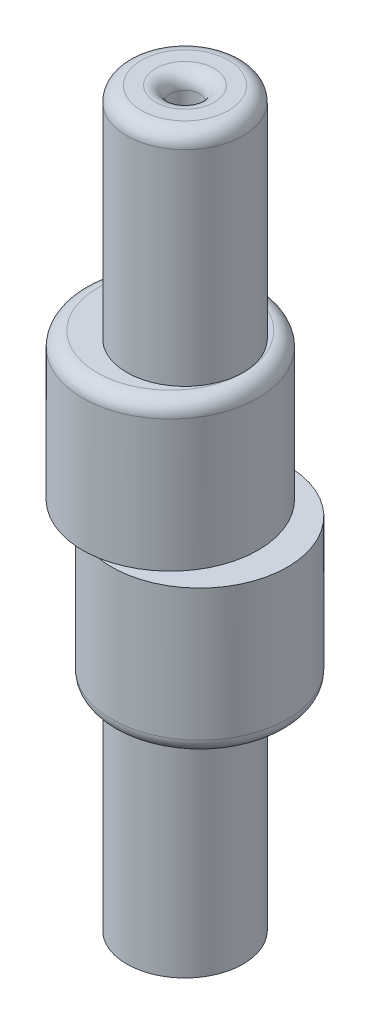
ISO-10303-21;
HEADER;
FILE_DESCRIPTION(('STEP AP214'),'2;1');
FILE_NAME('part.step','',(''),(''),'','','');
FILE_SCHEMA(('AUTOMOTIVE_DESIGN { 1 0 10303 214 1 1 1 1 }'));
ENDSEC;
DATA;
#1=APPLICATION_CONTEXT('core data for automotive mechanical design processes');
#2=APPLICATION_PROTOCOL_DEFINITION('international standard','automotive_design',2000,#1);
#3=PRODUCT_CONTEXT('',#1,'mechanical');
#4=PRODUCT('Part','Part','',(#3));
#5=PRODUCT_RELATED_PRODUCT_CATEGORY('part','',(#4));
#6=PRODUCT_DEFINITION_FORMATION('','',#4);
#7=PRODUCT_DEFINITION_CONTEXT('part definition',#1,'design');
#8=PRODUCT_DEFINITION('design','',#6,#7);
#9=PRODUCT_DEFINITION_SHAPE('','',#8);
#10=(LENGTH_UNIT() NAMED_UNIT(*) SI_UNIT(.MILLI.,.METRE.));
#11=(NAMED_UNIT(*) PLANE_ANGLE_UNIT() SI_UNIT($,.RADIAN.));
#12=(NAMED_UNIT(*) SI_UNIT($,.STERADIAN.) SOLID_ANGLE_UNIT());
#13=UNCERTAINTY_MEASURE_WITH_UNIT(LENGTH_MEASURE(1.E-05),#10,'distance_accuracy_value','');
#14=(GEOMETRIC_REPRESENTATION_CONTEXT(3) GLOBAL_UNCERTAINTY_ASSIGNED_CONTEXT((#13)) GLOBAL_UNIT_ASSIGNED_CONTEXT((#10,
#11,#12)) REPRESENTATION_CONTEXT('',''));
#15=CARTESIAN_POINT('',(0.,0.,0.));
#16=DIRECTION('',(0.,0.,1.));
#17=DIRECTION('',(1.,0.,0.));
#18=AXIS2_PLACEMENT_3D('',#15,#16,#17);
#19=CARTESIAN_POINT('',(0.,15.,0.));
#20=DIRECTION('',(0.,-1.,0.));
#21=DIRECTION('',(0.,0.,-1.));
#22=AXIS2_PLACEMENT_3D('',#19,#20,#21);
#23=CYLINDRICAL_SURFACE('',#22,3.975);
#24=CARTESIAN_POINT('',(0.,15.,0.));
#25=DIRECTION('',(0.,1.,0.));
#26=DIRECTION('',(0.,0.,1.));
#27=AXIS2_PLACEMENT_3D('',#24,#25,#26);
#28=CIRCLE('',#27,3.975);
#29=CARTESIAN_POINT('',(0.,15.,3.975));
#30=VERTEX_POINT('',#29);
#31=EDGE_CURVE('E123',#30,#30,#28,.T.);
#32=ORIENTED_EDGE('',*,*,#31,.F.);
#33=EDGE_LOOP('',(#32));
#34=FACE_BOUND('',#33,.T.);
#35=CARTESIAN_POINT('',(0.,0.,0.));
#36=DIRECTION('',(0.,1.,0.));
#37=DIRECTION('',(0.,0.,1.));
#38=AXIS2_PLACEMENT_3D('',#35,#36,#37);
#39=CIRCLE('',#38,3.975);
#40=CARTESIAN_POINT('',(0.,0.,3.975));
#41=VERTEX_POINT('',#40);
#42=EDGE_CURVE('E102',#41,#41,#39,.T.);
#43=ORIENTED_EDGE('',*,*,#42,.T.);
#44=EDGE_LOOP('',(#43));
#45=FACE_BOUND('',#44,.T.);
#46=ADVANCED_FACE('F45',(#34,#45),#23,.T.);
#47=CARTESIAN_POINT('',(0.,0.,0.));
#48=DIRECTION('',(0.,1.,0.));
#49=DIRECTION('',(0.,0.,1.));
#50=AXIS2_PLACEMENT_3D('',#47,#48,#49);
#51=PLANE('',#50);
#52=CARTESIAN_POINT('',(0.,0.,0.));
#53=DIRECTION('',(0.,1.,0.));
#54=DIRECTION('',(0.,0.,1.));
#55=AXIS2_PLACEMENT_3D('',#52,#53,#54);
#56=CIRCLE('',#55,3.65);
#57=CARTESIAN_POINT('',(1.84390889145858,0.,3.15));
#58=VERTEX_POINT('',#57);
#59=CARTESIAN_POINT('',(-1.84390889145858,0.,3.15));
#60=VERTEX_POINT('',#59);
#61=EDGE_CURVE('E171',#58,#60,#56,.T.);
#62=ORIENTED_EDGE('',*,*,#61,.T.);
#63=DIRECTION('',(-1.,0.,0.));
#64=VECTOR('',#63,1.);
#65=CARTESIAN_POINT('',(0.,0.,3.15));
#66=LINE('',#65,#64);
#67=EDGE_CURVE('E174',#60,#58,#66,.F.);
#68=ORIENTED_EDGE('',*,*,#67,.T.);
#69=EDGE_LOOP('',(#62,#68));
#70=FACE_BOUND('',#69,.T.);
#71=ORIENTED_EDGE('',*,*,#42,.F.);
#72=EDGE_LOOP('',(#71));
#73=FACE_BOUND('',#72,.T.);
#74=ADVANCED_FACE('F213',(#70,#73),#51,.F.);
#75=CARTESIAN_POINT('',(1.,25.,0.));
#76=DIRECTION('',(0.,-1.,0.));
#77=DIRECTION('',(0.,0.,-1.));
#78=AXIS2_PLACEMENT_3D('',#75,#76,#77);
#79=CYLINDRICAL_SURFACE('',#78,6.);
#80=CARTESIAN_POINT('',(1.,16.,0.));
#81=DIRECTION('',(0.,1.,0.));
#82=DIRECTION('',(0.,0.,1.));
#83=AXIS2_PLACEMENT_3D('',#80,#81,#82);
#84=CIRCLE('',#83,6.);
#85=CARTESIAN_POINT('',(1.,16.,6.));
#86=VERTEX_POINT('',#85);
#87=EDGE_CURVE('E135',#86,#86,#84,.T.);
#88=ORIENTED_EDGE('',*,*,#87,.T.);
#89=EDGE_LOOP('',(#88));
#90=FACE_BOUND('',#89,.T.);
#91=CARTESIAN_POINT('',(1.,25.,0.));
#92=DIRECTION('',(0.,1.,0.));
#93=DIRECTION('',(0.,0.,1.));
#94=AXIS2_PLACEMENT_3D('',#91,#92,#93);
#95=CIRCLE('',#94,6.);
#96=CARTESIAN_POINT('',(0.,25.,-5.91607978309962));
#97=VERTEX_POINT('',#96);
#98=CARTESIAN_POINT('',(0.,25.,5.91607978309962));
#99=VERTEX_POINT('',#98);
#100=EDGE_CURVE('E94',#97,#99,#95,.T.);
#101=ORIENTED_EDGE('',*,*,#100,.F.);
#102=EDGE_CURVE('E97',#99,#97,#95,.T.);
#103=ORIENTED_EDGE('',*,*,#102,.F.);
#104=EDGE_LOOP('',(#101,#103));
#105=FACE_BOUND('',#104,.T.);
#106=ADVANCED_FACE('F96',(#90,#105),#79,.T.);
#107=CARTESIAN_POINT('',(1.,25.,0.));
#108=DIRECTION('',(0.,1.,0.));
#109=DIRECTION('',(0.,0.,1.));
#110=AXIS2_PLACEMENT_3D('',#107,#108,#109);
#111=PLANE('',#110);
#112=CARTESIAN_POINT('',(-1.,25.,0.));
#113=DIRECTION('',(0.,1.,0.));
#114=DIRECTION('',(0.,0.,1.));
#115=AXIS2_PLACEMENT_3D('',#112,#113,#114);
#116=CIRCLE('',#115,6.);
#117=EDGE_CURVE('E107',#99,#97,#116,.T.);
#118=ORIENTED_EDGE('',*,*,#117,.F.);
#119=ORIENTED_EDGE('',*,*,#102,.T.);
#120=EDGE_LOOP('',(#118,#119));
#121=FACE_BOUND('',#120,.T.);
#122=ADVANCED_FACE('F105',(#121),#111,.T.);
#123=CARTESIAN_POINT('',(1.,15.,0.));
#124=DIRECTION('',(0.,1.,0.));
#125=DIRECTION('',(0.,0.,1.));
#126=AXIS2_PLACEMENT_3D('',#123,#124,#125);
#127=PLANE('',#126);
#128=CARTESIAN_POINT('',(1.,15.,0.));
#129=DIRECTION('',(0.,1.,0.));
#130=DIRECTION('',(0.,0.,1.));
#131=AXIS2_PLACEMENT_3D('',#128,#129,#130);
#132=CIRCLE('',#131,5.);
#133=CARTESIAN_POINT('',(1.,15.,5.));
#134=VERTEX_POINT('',#133);
#135=EDGE_CURVE('E139',#134,#134,#132,.F.);
#136=ORIENTED_EDGE('',*,*,#135,.T.);
#137=EDGE_LOOP('',(#136));
#138=FACE_BOUND('',#137,.T.);
#139=ORIENTED_EDGE('',*,*,#31,.T.);
#140=EDGE_LOOP('',(#139));
#141=FACE_BOUND('',#140,.T.);
#142=ADVANCED_FACE('F276',(#138,#141),#127,.F.);
#143=CARTESIAN_POINT('',(-1.,25.,0.));
#144=DIRECTION('',(0.,1.,0.));
#145=DIRECTION('',(0.,0.,1.));
#146=AXIS2_PLACEMENT_3D('',#143,#144,#145);
#147=PLANE('',#146);
#148=EDGE_CURVE('E109',#97,#99,#116,.T.);
#149=ORIENTED_EDGE('',*,*,#148,.F.);
#150=ORIENTED_EDGE('',*,*,#100,.T.);
#151=EDGE_LOOP('',(#149,#150));
#152=FACE_BOUND('',#151,.T.);
#153=ADVANCED_FACE('F110',(#152),#147,.F.);
#154=CARTESIAN_POINT('',(-1.,35.,0.));
#155=DIRECTION('',(0.,-1.,0.));
#156=DIRECTION('',(0.,0.,-1.));
#157=AXIS2_PLACEMENT_3D('',#154,#155,#156);
#158=CYLINDRICAL_SURFACE('',#157,6.);
#159=CARTESIAN_POINT('',(-1.,34.,0.));
#160=DIRECTION('',(0.,1.,0.));
#161=DIRECTION('',(0.,0.,1.));
#162=AXIS2_PLACEMENT_3D('',#159,#160,#161);
#163=CIRCLE('',#162,6.);
#164=CARTESIAN_POINT('',(-1.,34.,6.));
#165=VERTEX_POINT('',#164);
#166=EDGE_CURVE('E147',#165,#165,#163,.F.);
#167=ORIENTED_EDGE('',*,*,#166,.T.);
#168=EDGE_LOOP('',(#167));
#169=FACE_BOUND('',#168,.T.);
#170=ORIENTED_EDGE('',*,*,#117,.T.);
#171=ORIENTED_EDGE('',*,*,#148,.T.);
#172=EDGE_LOOP('',(#170,#171));
#173=FACE_BOUND('',#172,.T.);
#174=ADVANCED_FACE('F115',(#169,#173),#158,.T.);
#175=CARTESIAN_POINT('',(-1.,35.,0.));
#176=DIRECTION('',(0.,1.,0.));
#177=DIRECTION('',(0.,0.,1.));
#178=AXIS2_PLACEMENT_3D('',#175,#176,#177);
#179=PLANE('',#178);
#180=CARTESIAN_POINT('',(-1.,35.,0.));
#181=DIRECTION('',(0.,1.,0.));
#182=DIRECTION('',(0.,0.,1.));
#183=AXIS2_PLACEMENT_3D('',#180,#181,#182);
#184=CIRCLE('',#183,5.);
#185=CARTESIAN_POINT('',(-1.,35.,5.));
#186=VERTEX_POINT('',#185);
#187=EDGE_CURVE('E143',#186,#186,#184,.T.);
#188=ORIENTED_EDGE('',*,*,#187,.T.);
#189=EDGE_LOOP('',(#188));
#190=FACE_BOUND('',#189,.T.);
#191=CARTESIAN_POINT('',(0.,35.,0.));
#192=DIRECTION('',(0.,1.,0.));
#193=DIRECTION('',(0.,0.,1.));
#194=AXIS2_PLACEMENT_3D('',#191,#192,#193);
#195=CIRCLE('',#194,3.975);
#196=CARTESIAN_POINT('',(0.,35.,3.975));
#197=VERTEX_POINT('',#196);
#198=EDGE_CURVE('E120',#197,#197,#195,.T.);
#199=ORIENTED_EDGE('',*,*,#198,.F.);
#200=EDGE_LOOP('',(#199));
#201=FACE_BOUND('',#200,.T.);
#202=ADVANCED_FACE('F269',(#190,#201),#179,.T.);
#203=CARTESIAN_POINT('',(0.,50.,0.));
#204=DIRECTION('',(0.,-1.,0.));
#205=DIRECTION('',(0.,0.,-1.));
#206=AXIS2_PLACEMENT_3D('',#203,#204,#205);
#207=CYLINDRICAL_SURFACE('',#206,3.975);
#208=CARTESIAN_POINT('',(0.,49.,0.));
#209=DIRECTION('',(0.,1.,0.));
#210=DIRECTION('',(0.,0.,1.));
#211=AXIS2_PLACEMENT_3D('',#208,#209,#210);
#212=CIRCLE('',#211,3.975);
#213=CARTESIAN_POINT('',(0.,49.,3.975));
#214=VERTEX_POINT('',#213);
#215=EDGE_CURVE('E159',#214,#214,#212,.F.);
#216=ORIENTED_EDGE('',*,*,#215,.T.);
#217=EDGE_LOOP('',(#216));
#218=FACE_BOUND('',#217,.T.);
#219=ORIENTED_EDGE('',*,*,#198,.T.);
#220=EDGE_LOOP('',(#219));
#221=FACE_BOUND('',#220,.T.);
#222=ADVANCED_FACE('F244',(#218,#221),#207,.T.);
#223=CARTESIAN_POINT('',(0.,50.,0.));
#224=DIRECTION('',(0.,1.,0.));
#225=DIRECTION('',(0.,0.,1.));
#226=AXIS2_PLACEMENT_3D('',#223,#224,#225);
#227=PLANE('',#226);
#228=CARTESIAN_POINT('',(0.,50.,0.));
#229=DIRECTION('',(0.,1.,0.));
#230=DIRECTION('',(0.,0.,1.));
#231=AXIS2_PLACEMENT_3D('',#228,#229,#230);
#232=CIRCLE('',#231,2.975);
#233=CARTESIAN_POINT('',(0.,50.,2.975));
#234=VERTEX_POINT('',#233);
#235=EDGE_CURVE('E155',#234,#234,#232,.T.);
#236=ORIENTED_EDGE('',*,*,#235,.T.);
#237=EDGE_LOOP('',(#236));
#238=FACE_BOUND('',#237,.T.);
#239=CARTESIAN_POINT('',(0.,50.,0.));
#240=DIRECTION('',(0.,1.,0.));
#241=DIRECTION('',(0.,0.,1.));
#242=AXIS2_PLACEMENT_3D('',#239,#240,#241);
#243=CIRCLE('',#242,2.);
#244=CARTESIAN_POINT('',(0.,50.,2.));
#245=VERTEX_POINT('',#244);
#246=EDGE_CURVE('E151',#245,#245,#243,.F.);
#247=ORIENTED_EDGE('',*,*,#246,.T.);
#248=EDGE_LOOP('',(#247));
#249=FACE_BOUND('',#248,.T.);
#250=ADVANCED_FACE('F240',(#238,#249),#227,.T.);
#251=CARTESIAN_POINT('',(0.,35.1,0.));
#252=DIRECTION('',(0.,-1.,0.));
#253=DIRECTION('',(0.,0.,-1.));
#254=AXIS2_PLACEMENT_3D('',#251,#252,#253);
#255=CYLINDRICAL_SURFACE('',#254,2.65);
#256=DIRECTION('',(0.,-1.,0.));
#257=VECTOR('',#256,1.);
#258=CARTESIAN_POINT('',(1.54919333848297,35.1,2.15));
#259=LINE('',#258,#257);
#260=CARTESIAN_POINT('',(1.54919333848297,34.1,2.15));
#261=VERTEX_POINT('',#260);
#262=CARTESIAN_POINT('',(1.54919333848297,1.,2.15));
#263=VERTEX_POINT('',#262);
#264=EDGE_CURVE('E133',#261,#263,#259,.T.);
#265=ORIENTED_EDGE('',*,*,#264,.F.);
#266=CARTESIAN_POINT('',(0.,34.1,0.));
#267=DIRECTION('',(0.,-1.,0.));
#268=DIRECTION('',(0.,0.,-1.));
#269=AXIS2_PLACEMENT_3D('',#266,#267,#268);
#270=CIRCLE('',#269,2.65);
#271=CARTESIAN_POINT('',(-1.54919333848297,34.1,2.15));
#272=VERTEX_POINT('',#271);
#273=EDGE_CURVE('E61',#261,#272,#270,.F.);
#274=ORIENTED_EDGE('',*,*,#273,.T.);
#275=DIRECTION('',(0.,-1.,0.));
#276=VECTOR('',#275,1.);
#277=CARTESIAN_POINT('',(-1.54919333848297,35.1,2.15));
#278=LINE('',#277,#276);
#279=CARTESIAN_POINT('',(-1.54919333848297,1.,2.15));
#280=VERTEX_POINT('',#279);
#281=EDGE_CURVE('E113',#272,#280,#278,.T.);
#282=ORIENTED_EDGE('',*,*,#281,.T.);
#283=CARTESIAN_POINT('',(0.,1.,0.));
#284=DIRECTION('',(0.,1.,0.));
#285=DIRECTION('',(0.,0.,1.));
#286=AXIS2_PLACEMENT_3D('',#283,#284,#285);
#287=CIRCLE('',#286,2.65);
#288=EDGE_CURVE('E178',#280,#263,#287,.F.);
#289=ORIENTED_EDGE('',*,*,#288,.T.);
#290=EDGE_LOOP('',(#265,#274,#282,#289));
#291=FACE_BOUND('',#290,.T.);
#292=ADVANCED_FACE('F243',(#291),#255,.F.);
#293=CARTESIAN_POINT('',(-1.54919333848297,35.1,2.15));
#294=DIRECTION('',(0.,0.,1.));
#295=DIRECTION('',(1.,0.,0.));
#296=AXIS2_PLACEMENT_3D('',#293,#294,#295);
#297=PLANE('',#296);
#298=ORIENTED_EDGE('',*,*,#281,.F.);
#299=CARTESIAN_POINT('',(-1.54919333848297,34.1,2.15));
#300=CARTESIAN_POINT('',(-1.4708950740438,34.1457211361592,2.15));
#301=CARTESIAN_POINT('',(-1.39158390334064,34.1898517447115,2.15));
#302=CARTESIAN_POINT('',(-1.23033225600229,34.2738357482319,2.15));
#303=CARTESIAN_POINT('',(-1.14838242779727,34.3136710878092,2.15));
#304=CARTESIAN_POINT('',(-0.980535256221145,34.3881740952289,2.15));
#305=CARTESIAN_POINT('',(-0.894595532125602,34.4227479017511,2.15));
#306=CARTESIAN_POINT('',(-0.720058411378001,34.4840933489754,2.15));
#307=CARTESIAN_POINT('',(-0.631465424226713,34.5108772198591,2.15));
#308=CARTESIAN_POINT('',(-0.478788820000553,34.5481785287672,2.15));
#309=CARTESIAN_POINT('',(-0.415309246835552,34.5611652260823,2.15));
#310=CARTESIAN_POINT('',(-0.287468892272041,34.5817833497645,2.15));
#311=CARTESIAN_POINT('',(-0.223108100484572,34.5894147129403,2.15));
#312=CARTESIAN_POINT('',(-0.0945800226031941,34.5988657532261,2.15));
#313=CARTESIAN_POINT('',(-0.0304168561650289,34.6007407675897,2.15));
#314=CARTESIAN_POINT('',(0.097818029285098,34.5987310185585,2.15));
#315=CARTESIAN_POINT('',(0.161889748505525,34.5948462683149,2.15));
#316=CARTESIAN_POINT('',(0.28908857220855,34.581569414362,2.15));
#317=CARTESIAN_POINT('',(0.352218954658949,34.5722082106372,2.15));
#318=CARTESIAN_POINT('',(0.477532219441158,34.5484668403615,2.15));
#319=CARTESIAN_POINT('',(0.539714852428887,34.5340853760277,2.15));
#320=CARTESIAN_POINT('',(0.663698719051922,34.5006930698601,2.15));
#321=CARTESIAN_POINT('',(0.725483872068205,34.4816231834654,2.15));
#322=CARTESIAN_POINT('',(0.847700350682336,34.439631508857,2.15));
#323=CARTESIAN_POINT('',(0.908131962415962,34.4167105436317,2.15));
#324=CARTESIAN_POINT('',(1.05846124687037,34.3550028882549,2.15));
#325=CARTESIAN_POINT('',(1.14749885447921,34.3141262432276,2.15));
#326=CARTESIAN_POINT('',(1.32281639486265,34.2267954729352,2.15));
#327=CARTESIAN_POINT('',(1.40909447505609,34.1803376963832,2.15));
#328=CARTESIAN_POINT('',(1.57958079689267,34.0830431821203,2.15));
#329=CARTESIAN_POINT('',(1.66377944940883,34.032189774616,2.15));
#330=CARTESIAN_POINT('',(1.83012162544809,33.9272917731877,2.15));
#331=CARTESIAN_POINT('',(1.91226563499251,33.8732479443115,2.15));
#332=CARTESIAN_POINT('',(2.06998236410848,33.7660109862301,2.15));
#333=CARTESIAN_POINT('',(2.14565342620328,33.712961743589,2.15));
#334=CARTESIAN_POINT('',(2.29575121885375,33.6051230822549,2.15));
#335=CARTESIAN_POINT('',(2.37017784362159,33.5503335167562,2.15));
#336=CARTESIAN_POINT('',(2.51728787880208,33.439879921742,2.15));
#337=CARTESIAN_POINT('',(2.58998108985508,33.3842289025814,2.15));
#338=CARTESIAN_POINT('',(2.73447117555792,33.2718108471665,2.15));
#339=CARTESIAN_POINT('',(2.80626826952555,33.2150440930981,2.15));
#340=CARTESIAN_POINT('',(2.87770269075911,33.1578317444192,2.15));
#341=B_SPLINE_CURVE_WITH_KNOTS('',3,(#299,#300,#301,#302,#303,#304,#305,#306,#307,#308,#309,
#310,#311,#312,#313,#314,#315,#316,#317,#318,#319,#320,#321,#322,#323,#324,#325,#326,#327,#328,
#329,#330,#331,#332,#333,#334,#335,#336,#337,#338,#339,#340),.UNSPECIFIED.,.F.,.F.,(4,2,2,2,2,2,
2,2,2,2,2,2,2,2,2,2,2,2,2,2,4),(0.,0.272100692780207,0.545303911381297,0.822919932076311,
1.10009771390518,1.29428223279451,1.48846904295995,1.68078314564519,1.87309680922518,
2.06433569970824,2.25562406383977,2.44945736396358,2.64324929382951,2.93688609985732,
3.23071606589756,3.52571382171253,3.82064112357217,4.09785339301231,4.37508910927211,
4.64972621224574,4.92429472714717),.UNSPECIFIED.);
#342=EDGE_CURVE('E11',#272,#261,#341,.T.);
#343=ORIENTED_EDGE('',*,*,#342,.T.);
#344=ORIENTED_EDGE('',*,*,#264,.T.);
#345=DIRECTION('',(-1.,0.,0.));
#346=VECTOR('',#345,1.);
#347=CARTESIAN_POINT('',(-1.54919333848297,1.,2.15));
#348=LINE('',#347,#346);
#349=EDGE_CURVE('E167',#263,#280,#348,.T.);
#350=ORIENTED_EDGE('',*,*,#349,.T.);
#351=EDGE_LOOP('',(#298,#343,#344,#350));
#352=FACE_BOUND('',#351,.T.);
#353=ADVANCED_FACE('F257',(#352),#297,.F.);
#354=CARTESIAN_POINT('',(0.,35.1,0.));
#355=DIRECTION('',(0.,-1.,0.));
#356=DIRECTION('',(0.,0.,-1.));
#357=AXIS2_PLACEMENT_3D('',#354,#355,#356);
#358=PLANE('',#357);
#359=CARTESIAN_POINT('',(0.,35.1,0.));
#360=DIRECTION('',(0.,-1.,0.));
#361=DIRECTION('',(0.,0.,-1.));
#362=AXIS2_PLACEMENT_3D('',#359,#360,#361);
#363=CIRCLE('',#362,1.64999999999999);
#364=CARTESIAN_POINT('',(-0.96459207867807,35.1,1.33867924528301));
#365=VERTEX_POINT('',#364);
#366=EDGE_CURVE('E66',#365,#365,#363,.T.);
#367=ORIENTED_EDGE('',*,*,#366,.T.);
#368=EDGE_LOOP('',(#367));
#369=FACE_BOUND('',#368,.T.);
#370=CARTESIAN_POINT('',(0.,35.1,0.));
#371=DIRECTION('',(0.,-1.,0.));
#372=DIRECTION('',(0.,0.,-1.));
#373=AXIS2_PLACEMENT_3D('',#370,#371,#372);
#374=CIRCLE('',#373,1.);
#375=CARTESIAN_POINT('',(0.,35.1,1.));
#376=VERTEX_POINT('',#375);
#377=EDGE_CURVE('E130',#376,#376,#374,.T.);
#378=ORIENTED_EDGE('',*,*,#377,.F.);
#379=EDGE_LOOP('',(#378));
#380=FACE_BOUND('',#379,.T.);
#381=ADVANCED_FACE('F252',(#369,#380),#358,.T.);
#382=CARTESIAN_POINT('',(0.,5.,0.));
#383=DIRECTION('',(0.,1.,0.));
#384=DIRECTION('',(0.,0.,1.));
#385=AXIS2_PLACEMENT_3D('',#382,#383,#384);
#386=CYLINDRICAL_SURFACE('',#385,1.);
#387=CARTESIAN_POINT('',(0.,49.,0.));
#388=DIRECTION('',(0.,1.,0.));
#389=DIRECTION('',(0.,0.,1.));
#390=AXIS2_PLACEMENT_3D('',#387,#388,#389);
#391=CIRCLE('',#390,1.);
#392=CARTESIAN_POINT('',(0.,49.,1.));
#393=VERTEX_POINT('',#392);
#394=EDGE_CURVE('E163',#393,#393,#391,.T.);
#395=CARTESIAN_POINT('',(0.,49.,1.));
#396=CARTESIAN_POINT('',(0.,48.8552083333333,1.));
#397=CARTESIAN_POINT('',(0.,48.7104166666667,1.));
#398=CARTESIAN_POINT('',(0.,48.4208333333333,1.));
#399=CARTESIAN_POINT('',(0.,48.2760416666667,1.));
#400=CARTESIAN_POINT('',(0.,47.9864583333333,1.));
#401=CARTESIAN_POINT('',(0.,47.8416666666666,1.));
#402=CARTESIAN_POINT('',(0.,47.5520833333333,1.));
#403=CARTESIAN_POINT('',(0.,47.4072916666667,1.));
#404=CARTESIAN_POINT('',(0.,47.1177083333333,1.));
#405=CARTESIAN_POINT('',(0.,46.9729166666667,1.));
#406=CARTESIAN_POINT('',(0.,46.6833333333333,1.));
#407=CARTESIAN_POINT('',(0.,46.5385416666667,1.));
#408=CARTESIAN_POINT('',(0.,46.2489583333333,1.));
#409=CARTESIAN_POINT('',(0.,46.1041666666667,1.));
#410=CARTESIAN_POINT('',(0.,45.8145833333333,1.));
#411=CARTESIAN_POINT('',(0.,45.6697916666667,1.));
#412=CARTESIAN_POINT('',(0.,45.3802083333333,1.));
#413=CARTESIAN_POINT('',(0.,45.2354166666667,1.));
#414=CARTESIAN_POINT('',(0.,44.9458333333333,1.));
#415=CARTESIAN_POINT('',(0.,44.8010416666667,1.));
#416=CARTESIAN_POINT('',(0.,44.5114583333333,1.));
#417=CARTESIAN_POINT('',(0.,44.3666666666667,1.));
#418=CARTESIAN_POINT('',(0.,44.0770833333333,1.));
#419=CARTESIAN_POINT('',(0.,43.9322916666667,1.));
#420=CARTESIAN_POINT('',(0.,43.6427083333333,1.));
#421=CARTESIAN_POINT('',(0.,43.4979166666667,1.));
#422=CARTESIAN_POINT('',(0.,43.2083333333333,1.));
#423=CARTESIAN_POINT('',(0.,43.0635416666667,1.));
#424=CARTESIAN_POINT('',(0.,42.7739583333333,1.));
#425=CARTESIAN_POINT('',(0.,42.6291666666667,1.));
#426=CARTESIAN_POINT('',(0.,42.3395833333333,1.));
#427=CARTESIAN_POINT('',(0.,42.1947916666667,1.));
#428=CARTESIAN_POINT('',(0.,41.9052083333333,1.));
#429=CARTESIAN_POINT('',(0.,41.7604166666667,1.));
#430=CARTESIAN_POINT('',(0.,41.4708333333333,1.));
#431=CARTESIAN_POINT('',(0.,41.3260416666667,1.));
#432=CARTESIAN_POINT('',(0.,41.0364583333333,1.));
#433=CARTESIAN_POINT('',(0.,40.8916666666667,1.));
#434=CARTESIAN_POINT('',(0.,40.6020833333333,1.));
#435=CARTESIAN_POINT('',(0.,40.4572916666667,1.));
#436=CARTESIAN_POINT('',(0.,40.1677083333333,1.));
#437=CARTESIAN_POINT('',(0.,40.0229166666667,1.));
#438=CARTESIAN_POINT('',(0.,39.7333333333333,1.));
#439=CARTESIAN_POINT('',(0.,39.5885416666667,1.));
#440=CARTESIAN_POINT('',(0.,39.2989583333333,1.));
#441=CARTESIAN_POINT('',(0.,39.1541666666667,1.));
#442=CARTESIAN_POINT('',(0.,38.8645833333333,1.));
#443=CARTESIAN_POINT('',(0.,38.7197916666667,1.));
#444=CARTESIAN_POINT('',(0.,38.4302083333333,1.));
#445=CARTESIAN_POINT('',(0.,38.2854166666667,1.));
#446=CARTESIAN_POINT('',(0.,37.9958333333333,1.));
#447=CARTESIAN_POINT('',(0.,37.8510416666667,1.));
#448=CARTESIAN_POINT('',(0.,37.5614583333333,1.));
#449=CARTESIAN_POINT('',(0.,37.4166666666667,1.));
#450=CARTESIAN_POINT('',(0.,37.1270833333333,1.));
#451=CARTESIAN_POINT('',(0.,36.9822916666667,1.));
#452=CARTESIAN_POINT('',(0.,36.6927083333333,1.));
#453=CARTESIAN_POINT('',(0.,36.5479166666667,1.));
#454=CARTESIAN_POINT('',(0.,36.2583333333333,1.));
#455=CARTESIAN_POINT('',(0.,36.1135416666667,1.));
#456=CARTESIAN_POINT('',(0.,35.8239583333333,1.));
#457=CARTESIAN_POINT('',(0.,35.6791666666667,1.));
#458=CARTESIAN_POINT('',(0.,35.3895833333333,1.));
#459=CARTESIAN_POINT('',(0.,35.2447916666667,1.));
#460=CARTESIAN_POINT('',(0.,35.1,1.));
#461=B_SPLINE_CURVE_WITH_KNOTS('',3,(#395,#396,#397,#398,#399,#400,#401,#402,#403,#404,#405,
#406,#407,#408,#409,#410,#411,#412,#413,#414,#415,#416,#417,#418,#419,#420,#421,#422,#423,#424,
#425,#426,#427,#428,#429,#430,#431,#432,#433,#434,#435,#436,#437,#438,#439,#440,#441,#442,#443,
#444,#445,#446,#447,#448,#449,#450,#451,#452,#453,#454,#455,#456,#457,#458,#459,#460),
.UNSPECIFIED.,.F.,.F.,(4,2,2,2,2,2,2,2,2,2,2,2,2,2,2,2,2,2,2,2,2,2,2,2,2,2,2,2,2,2,2,2,4),(0.,
0.434375000000001,0.868750000000001,1.303125,1.7375,2.171875,2.60625,3.040625,3.475,3.909375,
4.34374999999999,4.77812499999999,5.2125,5.646875,6.08125,6.515625,6.95,7.38437499999999,
7.81874999999999,8.25312499999999,8.68749999999999,9.12187499999999,9.55624999999999,
9.99062499999999,10.425,10.859375,11.29375,11.728125,12.1625,12.596875,13.03125,13.465625,13.9),.UNSPECIFIED.);
#462=EDGE_CURVE('BSEAM228',#393,#376,#461,.T.);
#463=ORIENTED_EDGE('',*,*,#394,.T.);
#464=ORIENTED_EDGE('',*,*,#377,.T.);
#465=ORIENTED_EDGE('',*,*,#462,.T.);
#466=ORIENTED_EDGE('',*,*,#462,.F.);
#467=EDGE_LOOP('',(#463,#465,#464,#466));
#468=FACE_BOUND('',#467,.T.);
#469=ADVANCED_FACE('F228',(#468),#386,.F.);
#470=CARTESIAN_POINT('',(1.,16.,0.));
#471=DIRECTION('',(0.,1.,0.));
#472=DIRECTION('',(0.,0.,1.));
#473=AXIS2_PLACEMENT_3D('',#470,#471,#472);
#474=TOROIDAL_SURFACE('',#473,5.,1.);
#475=ORIENTED_EDGE('',*,*,#135,.F.);
#476=EDGE_LOOP('',(#475));
#477=FACE_BOUND('',#476,.T.);
#478=ORIENTED_EDGE('',*,*,#87,.F.);
#479=EDGE_LOOP('',(#478));
#480=FACE_BOUND('',#479,.T.);
#481=ADVANCED_FACE('F224',(#477,#480),#474,.T.);
#482=CARTESIAN_POINT('',(-1.,34.,0.));
#483=DIRECTION('',(0.,1.,0.));
#484=DIRECTION('',(0.,0.,1.));
#485=AXIS2_PLACEMENT_3D('',#482,#483,#484);
#486=TOROIDAL_SURFACE('',#485,5.,1.);
#487=ORIENTED_EDGE('',*,*,#166,.F.);
#488=EDGE_LOOP('',(#487));
#489=FACE_BOUND('',#488,.T.);
#490=ORIENTED_EDGE('',*,*,#187,.F.);
#491=EDGE_LOOP('',(#490));
#492=FACE_BOUND('',#491,.T.);
#493=ADVANCED_FACE('F227',(#489,#492),#486,.T.);
#494=CARTESIAN_POINT('',(0.,49.,0.));
#495=DIRECTION('',(0.,1.,0.));
#496=DIRECTION('',(0.,0.,1.));
#497=AXIS2_PLACEMENT_3D('',#494,#495,#496);
#498=TOROIDAL_SURFACE('',#497,2.975,1.);
#499=ORIENTED_EDGE('',*,*,#215,.F.);
#500=EDGE_LOOP('',(#499));
#501=FACE_BOUND('',#500,.T.);
#502=ORIENTED_EDGE('',*,*,#235,.F.);
#503=EDGE_LOOP('',(#502));
#504=FACE_BOUND('',#503,.T.);
#505=ADVANCED_FACE('F209',(#501,#504),#498,.T.);
#506=CARTESIAN_POINT('',(0.,49.,0.));
#507=DIRECTION('',(0.,1.,0.));
#508=DIRECTION('',(0.,0.,1.));
#509=AXIS2_PLACEMENT_3D('',#506,#507,#508);
#510=TOROIDAL_SURFACE('',#509,2.,1.);
#511=ORIENTED_EDGE('',*,*,#246,.F.);
#512=EDGE_LOOP('',(#511));
#513=FACE_BOUND('',#512,.T.);
#514=ORIENTED_EDGE('',*,*,#394,.F.);
#515=EDGE_LOOP('',(#514));
#516=FACE_BOUND('',#515,.T.);
#517=ADVANCED_FACE('F202',(#513,#516),#510,.T.);
#518=CARTESIAN_POINT('',(0.,1.,0.));
#519=DIRECTION('',(0.,1.,0.));
#520=DIRECTION('',(0.,0.,1.));
#521=AXIS2_PLACEMENT_3D('',#518,#519,#520);
#522=TOROIDAL_SURFACE('',#521,3.65,1.);
#523=CARTESIAN_POINT('',(-1.54919333848297,1.,2.15));
#524=CARTESIAN_POINT('',(-1.54919276193718,0.972796065164879,2.14999947843199));
#525=CARTESIAN_POINT('',(-1.54955189643765,0.945605592277207,2.15111082649074));
#526=CARTESIAN_POINT('',(-1.5509804970857,0.891428103201518,2.15553973513903));
#527=CARTESIAN_POINT('',(-1.55204984785484,0.864441054686203,2.15885693737582));
#528=CARTESIAN_POINT('',(-1.5563011564746,0.784199056613925,2.17206482759259));
#529=CARTESIAN_POINT('',(-1.56052648958222,0.731496173704708,2.18521204655712));
#530=CARTESIAN_POINT('',(-1.57154496776261,0.629182542952613,2.21972376035863));
#531=CARTESIAN_POINT('',(-1.57833791082575,0.579571552209205,2.24108760874527));
#532=CARTESIAN_POINT('',(-1.59417074956814,0.484688082964869,2.29131798937246));
#533=CARTESIAN_POINT('',(-1.60321113909357,0.43941656103739,2.32018617065318));
#534=CARTESIAN_POINT('',(-1.6233803663587,0.353355141822787,2.3852601833186));
#535=CARTESIAN_POINT('',(-1.63455182576184,0.312689808413166,2.42161724526852));
#536=CARTESIAN_POINT('',(-1.65840928192073,0.237981065433063,2.50017918309768));
#537=CARTESIAN_POINT('',(-1.67109581075636,0.203939993349622,2.54238611424319));
#538=CARTESIAN_POINT('',(-1.69813025167261,0.141891216351543,2.63345585337538));
#539=CARTESIAN_POINT('',(-1.71252668946099,0.114214650736053,2.68252973158171));
#540=CARTESIAN_POINT('',(-1.74202639896984,0.0675283391737274,2.78443878862931));
#541=CARTESIAN_POINT('',(-1.75712952261114,0.0485167864457573,2.83727318068992));
#542=CARTESIAN_POINT('',(-1.78387114769072,0.0231213238859439,2.93206301752178));
#543=CARTESIAN_POINT('',(-1.79545549764925,0.0147878498401539,2.97352608069284));
#544=CARTESIAN_POINT('',(-1.81858792133929,0.00343182836653237,3.05712883560604));
#545=CARTESIAN_POINT('',(-1.83013602222981,0.000399257254829449,3.09926709791545));
#546=CARTESIAN_POINT('',(-1.84235594716473,1.22618148790484E-05,3.14427482019009));
#547=CARTESIAN_POINT('',(-1.84313267781656,-3.32201603083275E-08,3.14713745218456));
#548=CARTESIAN_POINT('',(-1.84390889145858,0.,3.15));
#549=B_SPLINE_CURVE_WITH_KNOTS('',3,(#523,#524,#525,#526,#527,#528,#529,#530,#531,#532,#533,
#534,#535,#536,#537,#538,#539,#540,#541,#542,#543,#544,#545,#546,#547,#548),.UNSPECIFIED.,.F.,
.F.,(4,2,2,2,2,2,2,2,2,2,2,2,4),(0.,0.0815602382932905,0.1631072299279,0.325706525121211,
0.488293030291968,0.650915293292021,0.817216711972303,0.983576707041835,1.15725226000188,
1.33089158249849,1.46214781178117,1.59315557395756,1.60205394341145),.UNSPECIFIED.);
#550=EDGE_CURVE('E182',#60,#280,#549,.F.);
#551=ORIENTED_EDGE('',*,*,#550,.F.);
#552=ORIENTED_EDGE('',*,*,#61,.F.);
#553=CARTESIAN_POINT('',(1.54919333848297,1.,2.15));
#554=CARTESIAN_POINT('',(1.54919276193718,0.972796065164879,2.14999947843199));
#555=CARTESIAN_POINT('',(1.54955189643765,0.945605592277207,2.15111082649074));
#556=CARTESIAN_POINT('',(1.5509804970857,0.891428103201518,2.15553973513903));
#557=CARTESIAN_POINT('',(1.55204984785484,0.864441054686203,2.15885693737582));
#558=CARTESIAN_POINT('',(1.5563011564746,0.784199056613925,2.17206482759259));
#559=CARTESIAN_POINT('',(1.56052648958222,0.731496173704708,2.18521204655712));
#560=CARTESIAN_POINT('',(1.57154496776261,0.629182542952613,2.21972376035863));
#561=CARTESIAN_POINT('',(1.57833791082575,0.579571552209205,2.24108760874527));
#562=CARTESIAN_POINT('',(1.59417074956814,0.484688082964869,2.29131798937246));
#563=CARTESIAN_POINT('',(1.60321113909357,0.43941656103739,2.32018617065318));
#564=CARTESIAN_POINT('',(1.6233803663587,0.353355141822787,2.3852601833186));
#565=CARTESIAN_POINT('',(1.63455182576184,0.312689808413166,2.42161724526852));
#566=CARTESIAN_POINT('',(1.65840928192073,0.237981065433063,2.50017918309768));
#567=CARTESIAN_POINT('',(1.67109581075636,0.203939993349622,2.54238611424319));
#568=CARTESIAN_POINT('',(1.69813025167261,0.141891216351543,2.63345585337538));
#569=CARTESIAN_POINT('',(1.71252668946099,0.114214650736053,2.68252973158171));
#570=CARTESIAN_POINT('',(1.74202639896984,0.0675283391737274,2.78443878862931));
#571=CARTESIAN_POINT('',(1.75712952261114,0.0485167864457573,2.83727318068992));
#572=CARTESIAN_POINT('',(1.78387114769072,0.0231213238859439,2.93206301752178));
#573=CARTESIAN_POINT('',(1.79545549764925,0.0147878498401539,2.97352608069284));
#574=CARTESIAN_POINT('',(1.81858792133929,0.00343182836653237,3.05712883560604));
#575=CARTESIAN_POINT('',(1.83013602222981,0.000399257254829449,3.09926709791545));
#576=CARTESIAN_POINT('',(1.84235594716473,1.22618148790484E-05,3.14427482019009));
#577=CARTESIAN_POINT('',(1.84313267781656,-3.32201603083275E-08,3.14713745218456));
#578=CARTESIAN_POINT('',(1.84390889145858,0.,3.15));
#579=B_SPLINE_CURVE_WITH_KNOTS('',3,(#553,#554,#555,#556,#557,#558,#559,#560,#561,#562,#563,
#564,#565,#566,#567,#568,#569,#570,#571,#572,#573,#574,#575,#576,#577,#578),.UNSPECIFIED.,.F.,
.F.,(4,2,2,2,2,2,2,2,2,2,2,2,4),(0.,0.0815602382932905,0.1631072299279,0.325706525121211,
0.488293030291968,0.650915293292021,0.817216711972303,0.983576707041835,1.15725226000188,
1.33089158249849,1.46214781178117,1.59315557395756,1.60205394341145),.UNSPECIFIED.);
#580=EDGE_CURVE('E134',#263,#58,#579,.T.);
#581=ORIENTED_EDGE('',*,*,#580,.F.);
#582=ORIENTED_EDGE('',*,*,#288,.F.);
#583=EDGE_LOOP('',(#551,#552,#581,#582));
#584=FACE_BOUND('',#583,.T.);
#585=ADVANCED_FACE('F199',(#584),#522,.T.);
#586=CARTESIAN_POINT('',(-1.54919333848297,1.,3.15));
#587=DIRECTION('',(-1.,0.,0.));
#588=DIRECTION('',(0.,0.,1.));
#589=AXIS2_PLACEMENT_3D('',#586,#587,#588);
#590=CYLINDRICAL_SURFACE('',#589,1.);
#591=ORIENTED_EDGE('',*,*,#580,.T.);
#592=ORIENTED_EDGE('',*,*,#67,.F.);
#593=ORIENTED_EDGE('',*,*,#550,.T.);
#594=ORIENTED_EDGE('',*,*,#349,.F.);
#595=EDGE_LOOP('',(#591,#592,#593,#594));
#596=FACE_BOUND('',#595,.T.);
#597=ADVANCED_FACE('F196',(#596),#590,.T.);
#598=CARTESIAN_POINT('',(0.,35.1,0.));
#599=DIRECTION('',(0.,-1.,0.));
#600=DIRECTION('',(0.,0.,-1.));
#601=AXIS2_PLACEMENT_3D('',#598,#599,#600);
#602=CONICAL_SURFACE('',#601,1.64999999999999,0.785398163397455);
#603=ORIENTED_EDGE('',*,*,#342,.F.);
#604=ORIENTED_EDGE('',*,*,#273,.F.);
#605=EDGE_LOOP('',(#603,#604));
#606=FACE_BOUND('',#605,.T.);
#607=ORIENTED_EDGE('',*,*,#366,.F.);
#608=EDGE_LOOP('',(#607));
#609=FACE_BOUND('',#608,.T.);
#610=ADVANCED_FACE('F48',(#606,#609),#602,.F.);
#611=CLOSED_SHELL('',(#46,#74,#106,#122,#142,#153,#174,#202,#222,#250,#292,#353,#381,#469,#481,
#493,#505,#517,#585,#597,#610));
#612=MANIFOLD_SOLID_BREP('B2',#611);
#613=ADVANCED_BREP_SHAPE_REPRESENTATION('',(#18,#612),#14);
#614=SHAPE_DEFINITION_REPRESENTATION(#9,#613);
ENDSEC;
END-ISO-10303-21;
